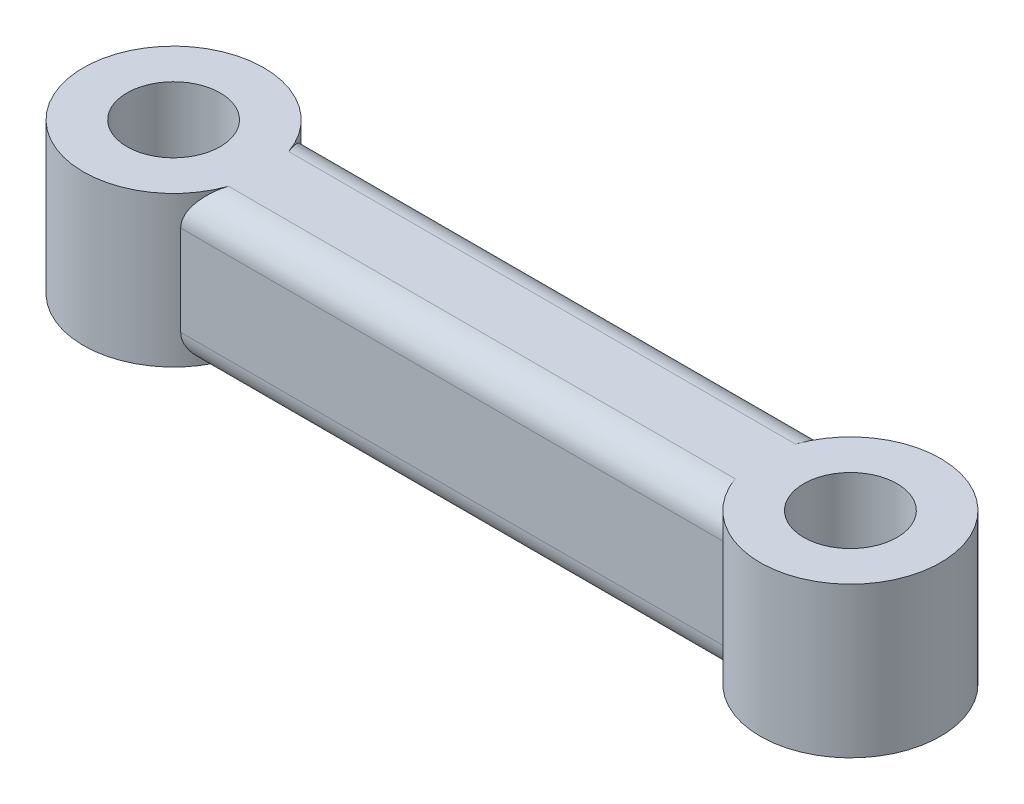
ISO-10303-21;
HEADER;
FILE_DESCRIPTION(('STEP AP214'),'2;1');
FILE_NAME('part.step','',(''),(''),'','','');
FILE_SCHEMA(('AUTOMOTIVE_DESIGN { 1 0 10303 214 1 1 1 1 }'));
ENDSEC;
DATA;
#1=APPLICATION_CONTEXT('core data for automotive mechanical design processes');
#2=APPLICATION_PROTOCOL_DEFINITION('international standard','automotive_design',2000,#1);
#3=PRODUCT_CONTEXT('',#1,'mechanical');
#4=PRODUCT('Part','Part','',(#3));
#5=PRODUCT_RELATED_PRODUCT_CATEGORY('part','',(#4));
#6=PRODUCT_DEFINITION_FORMATION('','',#4);
#7=PRODUCT_DEFINITION_CONTEXT('part definition',#1,'design');
#8=PRODUCT_DEFINITION('design','',#6,#7);
#9=PRODUCT_DEFINITION_SHAPE('','',#8);
#10=(LENGTH_UNIT() NAMED_UNIT(*) SI_UNIT(.MILLI.,.METRE.));
#11=(NAMED_UNIT(*) PLANE_ANGLE_UNIT() SI_UNIT($,.RADIAN.));
#12=(NAMED_UNIT(*) SI_UNIT($,.STERADIAN.) SOLID_ANGLE_UNIT());
#13=UNCERTAINTY_MEASURE_WITH_UNIT(LENGTH_MEASURE(1.E-05),#10,'distance_accuracy_value','');
#14=(GEOMETRIC_REPRESENTATION_CONTEXT(3) GLOBAL_UNCERTAINTY_ASSIGNED_CONTEXT((#13)) GLOBAL_UNIT_ASSIGNED_CONTEXT((#10,
#11,#12)) REPRESENTATION_CONTEXT('',''));
#15=CARTESIAN_POINT('',(0.,0.,0.));
#16=DIRECTION('',(0.,0.,1.));
#17=DIRECTION('',(1.,0.,0.));
#18=AXIS2_PLACEMENT_3D('',#15,#16,#17);
#19=CARTESIAN_POINT('',(-11.25,5.,0.));
#20=DIRECTION('',(0.,1.,0.));
#21=DIRECTION('',(0.,0.,1.));
#22=AXIS2_PLACEMENT_3D('',#19,#20,#21);
#23=PLANE('',#22);
#24=CARTESIAN_POINT('',(-11.25,5.,0.));
#25=DIRECTION('',(0.,1.,0.));
#26=DIRECTION('',(0.,0.,1.));
#27=AXIS2_PLACEMENT_3D('',#24,#25,#26);
#28=CIRCLE('',#27,1.55000000000002);
#29=CARTESIAN_POINT('',(-11.25,5.,1.55));
#30=VERTEX_POINT('',#29);
#31=EDGE_CURVE('E274',#30,#30,#28,.T.);
#32=ORIENTED_EDGE('',*,*,#31,.F.);
#33=EDGE_LOOP('',(#32));
#34=FACE_BOUND('',#33,.T.);
#35=DIRECTION('',(-1.,0.,0.));
#36=VECTOR('',#35,1.);
#37=CARTESIAN_POINT('',(-9.01393202250021,5.,-1.00000000000001));
#38=LINE('',#37,#36);
#39=CARTESIAN_POINT('',(8.42157287525381,5.,-1.00000000000001));
#40=VERTEX_POINT('',#39);
#41=CARTESIAN_POINT('',(-8.42157287525381,5.,-1.00000000000001));
#42=VERTEX_POINT('',#41);
#43=EDGE_CURVE('E169',#40,#42,#38,.T.);
#44=ORIENTED_EDGE('',*,*,#43,.T.);
#45=CARTESIAN_POINT('',(-11.25,5.,0.));
#46=DIRECTION('',(0.,1.,0.));
#47=DIRECTION('',(0.,0.,1.));
#48=AXIS2_PLACEMENT_3D('',#45,#46,#47);
#49=CIRCLE('',#48,3.);
#50=CARTESIAN_POINT('',(-8.42157287525381,5.,0.999999999999986));
#51=VERTEX_POINT('',#50);
#52=EDGE_CURVE('E66',#42,#51,#49,.T.);
#53=ORIENTED_EDGE('',*,*,#52,.T.);
#54=DIRECTION('',(1.,0.,0.));
#55=VECTOR('',#54,1.);
#56=CARTESIAN_POINT('',(9.01393202250021,5.,0.999999999999986));
#57=LINE('',#56,#55);
#58=CARTESIAN_POINT('',(8.42157287525381,5.,0.999999999999986));
#59=VERTEX_POINT('',#58);
#60=EDGE_CURVE('E166',#51,#59,#57,.T.);
#61=ORIENTED_EDGE('',*,*,#60,.T.);
#62=CARTESIAN_POINT('',(11.25,5.,0.));
#63=DIRECTION('',(0.,1.,0.));
#64=DIRECTION('',(0.,0.,1.));
#65=AXIS2_PLACEMENT_3D('',#62,#63,#64);
#66=CIRCLE('',#65,3.);
#67=EDGE_CURVE('E74',#59,#40,#66,.T.);
#68=ORIENTED_EDGE('',*,*,#67,.T.);
#69=EDGE_LOOP('',(#44,#53,#61,#68));
#70=FACE_BOUND('',#69,.T.);
#71=CARTESIAN_POINT('',(11.25,5.,0.));
#72=DIRECTION('',(0.,1.,0.));
#73=DIRECTION('',(0.,0.,1.));
#74=AXIS2_PLACEMENT_3D('',#71,#72,#73);
#75=CIRCLE('',#74,1.55000000000002);
#76=CARTESIAN_POINT('',(11.25,5.,1.55));
#77=VERTEX_POINT('',#76);
#78=EDGE_CURVE('E263',#77,#77,#75,.T.);
#79=ORIENTED_EDGE('',*,*,#78,.F.);
#80=EDGE_LOOP('',(#79));
#81=FACE_BOUND('',#80,.T.);
#82=ADVANCED_FACE('F45',(#34,#70,#81),#23,.T.);
#83=CARTESIAN_POINT('',(-11.25,0.,0.));
#84=DIRECTION('',(0.,1.,0.));
#85=DIRECTION('',(0.,0.,1.));
#86=AXIS2_PLACEMENT_3D('',#83,#84,#85);
#87=PLANE('',#86);
#88=CARTESIAN_POINT('',(-11.25,0.,0.));
#89=DIRECTION('',(0.,1.,0.));
#90=DIRECTION('',(0.,0.,1.));
#91=AXIS2_PLACEMENT_3D('',#88,#89,#90);
#92=CIRCLE('',#91,3.);
#93=CARTESIAN_POINT('',(-8.42157287525381,0.,-1.00000000000001));
#94=VERTEX_POINT('',#93);
#95=CARTESIAN_POINT('',(-8.42157287525381,0.,0.999999999999986));
#96=VERTEX_POINT('',#95);
#97=EDGE_CURVE('E278',#94,#96,#92,.T.);
#98=ORIENTED_EDGE('',*,*,#97,.F.);
#99=DIRECTION('',(-1.,0.,0.));
#100=VECTOR('',#99,1.);
#101=CARTESIAN_POINT('',(-11.25,0.,-1.00000000000001));
#102=LINE('',#101,#100);
#103=CARTESIAN_POINT('',(8.42157287525381,0.,-1.00000000000001));
#104=VERTEX_POINT('',#103);
#105=EDGE_CURVE('E155',#94,#104,#102,.F.);
#106=ORIENTED_EDGE('',*,*,#105,.T.);
#107=CARTESIAN_POINT('',(11.25,0.,0.));
#108=DIRECTION('',(0.,1.,0.));
#109=DIRECTION('',(0.,0.,1.));
#110=AXIS2_PLACEMENT_3D('',#107,#108,#109);
#111=CIRCLE('',#110,3.);
#112=CARTESIAN_POINT('',(8.42157287525381,0.,0.999999999999986));
#113=VERTEX_POINT('',#112);
#114=EDGE_CURVE('E284',#113,#104,#111,.T.);
#115=ORIENTED_EDGE('',*,*,#114,.F.);
#116=DIRECTION('',(1.,0.,0.));
#117=VECTOR('',#116,1.);
#118=CARTESIAN_POINT('',(-11.25,0.,0.999999999999986));
#119=LINE('',#118,#117);
#120=EDGE_CURVE('E145',#113,#96,#119,.F.);
#121=ORIENTED_EDGE('',*,*,#120,.T.);
#122=EDGE_LOOP('',(#98,#106,#115,#121));
#123=FACE_BOUND('',#122,.T.);
#124=CARTESIAN_POINT('',(-11.25,0.,0.));
#125=DIRECTION('',(0.,1.,0.));
#126=DIRECTION('',(0.,0.,1.));
#127=AXIS2_PLACEMENT_3D('',#124,#125,#126);
#128=CIRCLE('',#127,1.55000000000002);
#129=CARTESIAN_POINT('',(-11.25,0.,1.55));
#130=VERTEX_POINT('',#129);
#131=EDGE_CURVE('E271',#130,#130,#128,.T.);
#132=ORIENTED_EDGE('',*,*,#131,.T.);
#133=EDGE_LOOP('',(#132));
#134=FACE_BOUND('',#133,.T.);
#135=CARTESIAN_POINT('',(11.25,0.,0.));
#136=DIRECTION('',(0.,1.,0.));
#137=DIRECTION('',(0.,0.,1.));
#138=AXIS2_PLACEMENT_3D('',#135,#136,#137);
#139=CIRCLE('',#138,1.55000000000002);
#140=CARTESIAN_POINT('',(11.25,0.,1.55));
#141=VERTEX_POINT('',#140);
#142=EDGE_CURVE('E266',#141,#141,#139,.T.);
#143=ORIENTED_EDGE('',*,*,#142,.T.);
#144=EDGE_LOOP('',(#143));
#145=FACE_BOUND('',#144,.T.);
#146=ADVANCED_FACE('F242',(#123,#134,#145),#87,.F.);
#147=CARTESIAN_POINT('',(-11.25,5.,0.));
#148=DIRECTION('',(0.,-1.,0.));
#149=DIRECTION('',(0.,0.,-1.));
#150=AXIS2_PLACEMENT_3D('',#147,#148,#149);
#151=CYLINDRICAL_SURFACE('',#150,3.);
#152=ORIENTED_EDGE('',*,*,#97,.T.);
#153=CARTESIAN_POINT('',(-8.42157287525381,0.,0.999999999999986));
#154=CARTESIAN_POINT('',(-8.43233517576139,1.47025831379735E-07,1.03044942642672));
#155=CARTESIAN_POINT('',(-8.44358757525056,0.00139098588075769,1.06070098630823));
#156=CARTESIAN_POINT('',(-8.46696373571454,0.00684325564355595,1.12059756215042));
#157=CARTESIAN_POINT('',(-8.47908686796006,0.0109027765076651,1.150242996295));
#158=CARTESIAN_POINT('',(-8.51648530016051,0.026862503564235,1.23769606182971));
#159=CARTESIAN_POINT('',(-8.54291075093985,0.0425464544835447,1.29436082483727));
#160=CARTESIAN_POINT('',(-8.59763306949416,0.0830028766976726,1.40308786306568));
#161=CARTESIAN_POINT('',(-8.62592484043369,0.107751372161834,1.4551618342397));
#162=CARTESIAN_POINT('',(-8.6833068382165,0.165604235260205,1.55414443882939));
#163=CARTESIAN_POINT('',(-8.71239874224372,0.198727572140649,1.60104099408684));
#164=CARTESIAN_POINT('',(-8.77242040473922,0.27596784456181,1.69258643314291));
#165=CARTESIAN_POINT('',(-8.80328884317301,0.320792154059737,1.73668153203027));
#166=CARTESIAN_POINT('',(-8.86191393352655,0.419134072679211,1.81644889482888));
#167=CARTESIAN_POINT('',(-8.88967563840865,0.4726372083203,1.8521349433923));
#168=CARTESIAN_POINT('',(-8.93157850747652,0.570312165104469,1.90412268271449));
#169=CARTESIAN_POINT('',(-8.9473014831952,0.612425169892272,1.92302400556256));
#170=CARTESIAN_POINT('',(-8.9744498789463,0.700006481076328,1.9550733900818));
#171=CARTESIAN_POINT('',(-8.98588897473448,0.745463546196448,1.96823978214784));
#172=CARTESIAN_POINT('',(-9.00086196439744,0.825815176698794,1.98531460279487));
#173=CARTESIAN_POINT('',(-9.00570884035617,0.86013874998483,1.99077843535268));
#174=CARTESIAN_POINT('',(-9.01226906461626,0.929623614997975,1.99814093878302));
#175=CARTESIAN_POINT('',(-9.0139672685714,0.964788135638415,2.00002238038764));
#176=CARTESIAN_POINT('',(-9.01393202250021,1.,1.99999999999999));
#177=B_SPLINE_CURVE_WITH_KNOTS('',3,(#153,#154,#155,#156,#157,#158,#159,#160,#161,#162,#163,
#164,#165,#166,#167,#168,#169,#170,#171,#172,#173,#174,#175,#176),.UNSPECIFIED.,.F.,.F.,(4,2,2,
2,2,2,2,2,2,2,2,4),(0.,0.0968109008177377,0.193552586933967,0.385966911207454,0.577875929835666,
0.770223583868757,0.979365970066733,1.18816309386807,1.33392917155905,1.47922585995186,
1.58418679582683,1.68965127161098),.UNSPECIFIED.);
#178=CARTESIAN_POINT('',(-9.01393202250021,1.,1.99999999999999));
#179=VERTEX_POINT('',#178);
#180=EDGE_CURVE('E125',#96,#179,#177,.T.);
#181=ORIENTED_EDGE('',*,*,#180,.T.);
#182=DIRECTION('',(0.,-1.,0.));
#183=VECTOR('',#182,1.);
#184=CARTESIAN_POINT('',(-9.01393202250021,5.,1.99999999999999));
#185=LINE('',#184,#183);
#186=CARTESIAN_POINT('',(-9.01393202250021,4.,1.99999999999999));
#187=VERTEX_POINT('',#186);
#188=EDGE_CURVE('E141',#187,#179,#185,.T.);
#189=ORIENTED_EDGE('',*,*,#188,.F.);
#190=CARTESIAN_POINT('',(-9.01393202250021,4.,1.99999999999999));
#191=CARTESIAN_POINT('',(-9.01393796557844,4.02391674017118,2.00000329668173));
#192=CARTESIAN_POINT('',(-9.01316380923422,4.04781798398738,1.99914135987713));
#193=CARTESIAN_POINT('',(-9.0101144678481,4.0953794948633,1.99572567445577));
#194=CARTESIAN_POINT('',(-9.00784078329477,4.11903997882953,1.99317361703143));
#195=CARTESIAN_POINT('',(-8.99891819019792,4.18893541764985,1.98310696948458));
#196=CARTESIAN_POINT('',(-8.9901651638575,4.2345831983466,1.97318007186762));
#197=CARTESIAN_POINT('',(-8.96807102819015,4.32279452639175,1.94758280817724));
#198=CARTESIAN_POINT('',(-8.95474667953703,4.36536866244477,1.93193340994153));
#199=CARTESIAN_POINT('',(-8.92464682588156,4.44711486052573,1.89559786093323));
#200=CARTESIAN_POINT('',(-8.9078614164918,4.48627668973856,1.87489722332746));
#201=CARTESIAN_POINT('',(-8.86497890475231,4.57522117108196,1.82024603742725));
#202=CARTESIAN_POINT('',(-8.83779434408434,4.62323692554223,1.78426977251349));
#203=CARTESIAN_POINT('',(-8.78125407679592,4.71149795447996,1.70518744868163));
#204=CARTESIAN_POINT('',(-8.75189568589789,4.75173339272668,1.66207249081698));
#205=CARTESIAN_POINT('',(-8.69248402572522,4.8243781906931,1.56913530651191));
#206=CARTESIAN_POINT('',(-8.66242666204114,4.85669601861478,1.51924413626164));
#207=CARTESIAN_POINT('',(-8.60349752930198,4.91217000304991,1.414090218862));
#208=CARTESIAN_POINT('',(-8.57462358028198,4.9353437527091,1.35883804409186));
#209=CARTESIAN_POINT('',(-8.52399277789994,4.9685848152875,1.25366576913304));
#210=CARTESIAN_POINT('',(-8.50185706767676,4.980203774164,1.20441887915713));
#211=CARTESIAN_POINT('',(-8.45984244217292,4.99592564241239,1.10365997855418));
#212=CARTESIAN_POINT('',(-8.43996985249315,5.00000794772756,1.05214215153635));
#213=CARTESIAN_POINT('',(-8.42157287525381,5.,0.999999999999986));
#214=B_SPLINE_CURVE_WITH_KNOTS('',3,(#190,#191,#192,#193,#194,#195,#196,#197,#198,#199,#200,
#201,#202,#203,#204,#205,#206,#207,#208,#209,#210,#211,#212,#213),.UNSPECIFIED.,.F.,.F.,(4,2,2,
2,2,2,2,2,2,2,2,4),(0.,0.0716933308614944,0.143315031101967,0.285085731109906,0.426342090125624,
0.568008431369151,0.764585362662296,0.961409213546178,1.16041114714833,1.35902831333613,
1.52413471356289,1.6896918247817),.UNSPECIFIED.);
#215=EDGE_CURVE('E11',#187,#51,#214,.T.);
#216=ORIENTED_EDGE('',*,*,#215,.T.);
#217=ORIENTED_EDGE('',*,*,#52,.F.);
#218=CARTESIAN_POINT('',(-8.42157287525381,5.,-1.00000000000001));
#219=CARTESIAN_POINT('',(-8.43233517576139,4.99999985297417,-1.03044942642674));
#220=CARTESIAN_POINT('',(-8.44358757525056,4.99860901411924,-1.06070098630826));
#221=CARTESIAN_POINT('',(-8.46696373571454,4.99315674435644,-1.12059756215044));
#222=CARTESIAN_POINT('',(-8.47908686796006,4.98909722349233,-1.15024299629503));
#223=CARTESIAN_POINT('',(-8.51648530016051,4.97313749643577,-1.23769606182974));
#224=CARTESIAN_POINT('',(-8.54291075093985,4.95745354551646,-1.2943608248373));
#225=CARTESIAN_POINT('',(-8.59763306949416,4.91699712330233,-1.40308786306571));
#226=CARTESIAN_POINT('',(-8.62592484043369,4.89224862783817,-1.45516183423972));
#227=CARTESIAN_POINT('',(-8.6833068382165,4.83439576473979,-1.55414443882942));
#228=CARTESIAN_POINT('',(-8.71239874224371,4.80127242785935,-1.60104099408686));
#229=CARTESIAN_POINT('',(-8.77242040473922,4.72403215543819,-1.69258643314294));
#230=CARTESIAN_POINT('',(-8.80328884317301,4.67920784594026,-1.7366815320303));
#231=CARTESIAN_POINT('',(-8.86191393352655,4.58086592732079,-1.81644889482891));
#232=CARTESIAN_POINT('',(-8.88967563840865,4.5273627916797,-1.85213494339233));
#233=CARTESIAN_POINT('',(-8.93157850747652,4.42968783489553,-1.90412268271452));
#234=CARTESIAN_POINT('',(-8.9473014831952,4.38757483010773,-1.92302400556259));
#235=CARTESIAN_POINT('',(-8.9744498789463,4.29999351892367,-1.95507339008183));
#236=CARTESIAN_POINT('',(-8.98588897473448,4.25453645380355,-1.96823978214787));
#237=CARTESIAN_POINT('',(-9.00086196439744,4.1741848233012,-1.9853146027949));
#238=CARTESIAN_POINT('',(-9.00570884035617,4.13986125001517,-1.99077843535271));
#239=CARTESIAN_POINT('',(-9.01226906461626,4.07037638500202,-1.99814093878305));
#240=CARTESIAN_POINT('',(-9.0139672685714,4.03521186436158,-2.00002238038767));
#241=CARTESIAN_POINT('',(-9.01393202250021,4.,-2.00000000000001));
#242=B_SPLINE_CURVE_WITH_KNOTS('',3,(#218,#219,#220,#221,#222,#223,#224,#225,#226,#227,#228,
#229,#230,#231,#232,#233,#234,#235,#236,#237,#238,#239,#240,#241),.UNSPECIFIED.,.F.,.F.,(4,2,2,
2,2,2,2,2,2,2,2,4),(0.,0.0968109008177375,0.193552586933967,0.385966911207455,0.577875929835666,
0.770223583868757,0.979365970066734,1.18816309386807,1.33392917155905,1.47922585995186,
1.58418679582683,1.68965127161098),.UNSPECIFIED.);
#243=CARTESIAN_POINT('',(-9.01393202250021,4.,-2.00000000000001));
#244=VERTEX_POINT('',#243);
#245=EDGE_CURVE('E115',#42,#244,#242,.T.);
#246=ORIENTED_EDGE('',*,*,#245,.T.);
#247=DIRECTION('',(0.,-1.,0.));
#248=VECTOR('',#247,1.);
#249=CARTESIAN_POINT('',(-9.01393202250021,5.,-2.00000000000001));
#250=LINE('',#249,#248);
#251=CARTESIAN_POINT('',(-9.01393202250021,1.,-2.00000000000001));
#252=VERTEX_POINT('',#251);
#253=EDGE_CURVE('E119',#244,#252,#250,.T.);
#254=ORIENTED_EDGE('',*,*,#253,.T.);
#255=CARTESIAN_POINT('',(-9.01393202250021,1.,-2.00000000000001));
#256=CARTESIAN_POINT('',(-9.01393796557844,0.976083259828825,-2.00000329668176));
#257=CARTESIAN_POINT('',(-9.01316380923422,0.952182016012617,-1.99914135987716));
#258=CARTESIAN_POINT('',(-9.0101144678481,0.904620505136705,-1.99572567445579));
#259=CARTESIAN_POINT('',(-9.00784078329477,0.880960021170475,-1.99317361703145));
#260=CARTESIAN_POINT('',(-8.99891819019792,0.811064582350152,-1.9831069694846));
#261=CARTESIAN_POINT('',(-8.9901651638575,0.765416801653398,-1.97318007186765));
#262=CARTESIAN_POINT('',(-8.96807102819015,0.677205473608251,-1.94758280817726));
#263=CARTESIAN_POINT('',(-8.95474667953703,0.634631337555232,-1.93193340994156));
#264=CARTESIAN_POINT('',(-8.92464682588156,0.552885139474272,-1.89559786093326));
#265=CARTESIAN_POINT('',(-8.9078614164918,0.513723310261438,-1.87489722332748));
#266=CARTESIAN_POINT('',(-8.86497890475231,0.424778828918037,-1.82024603742727));
#267=CARTESIAN_POINT('',(-8.83779434408434,0.376763074457771,-1.78426977251352));
#268=CARTESIAN_POINT('',(-8.78125407679592,0.28850204552004,-1.70518744868166));
#269=CARTESIAN_POINT('',(-8.75189568589789,0.24826660727332,-1.66207249081701));
#270=CARTESIAN_POINT('',(-8.69248402572522,0.1756218093069,-1.56913530651194));
#271=CARTESIAN_POINT('',(-8.66242666204115,0.143303981385224,-1.51924413626167));
#272=CARTESIAN_POINT('',(-8.60349752930199,0.08782999695009,-1.41409021886203));
#273=CARTESIAN_POINT('',(-8.57462358028198,0.0646562472909031,-1.35883804409189));
#274=CARTESIAN_POINT('',(-8.52399277789994,0.0314151847125046,-1.25366576913306));
#275=CARTESIAN_POINT('',(-8.50185706767676,0.0197962258360041,-1.20441887915716));
#276=CARTESIAN_POINT('',(-8.45984244217292,0.00407435758760779,-1.10365997855421));
#277=CARTESIAN_POINT('',(-8.43996985249315,-7.94772755718988E-06,-1.05214215153638));
#278=CARTESIAN_POINT('',(-8.42157287525381,0.,-1.00000000000001));
#279=B_SPLINE_CURVE_WITH_KNOTS('',3,(#255,#256,#257,#258,#259,#260,#261,#262,#263,#264,#265,
#266,#267,#268,#269,#270,#271,#272,#273,#274,#275,#276,#277,#278),.UNSPECIFIED.,.F.,.F.,(4,2,2,
2,2,2,2,2,2,2,2,4),(0.,0.0716933308614927,0.143315031101966,0.285085731109906,0.426342090125624,
0.568008431369151,0.764585362662296,0.961409213546179,1.16041114714833,1.35902831333613,
1.52413471356289,1.6896918247817),.UNSPECIFIED.);
#280=EDGE_CURVE('E172',#252,#94,#279,.T.);
#281=ORIENTED_EDGE('',*,*,#280,.T.);
#282=EDGE_LOOP('',(#152,#181,#189,#216,#217,#246,#254,#281));
#283=FACE_BOUND('',#282,.T.);
#284=ADVANCED_FACE('F117',(#283),#151,.T.);
#285=CARTESIAN_POINT('',(-9.01393202250021,5.,1.99999999999999));
#286=DIRECTION('',(0.,0.,-1.));
#287=DIRECTION('',(-1.,0.,0.));
#288=AXIS2_PLACEMENT_3D('',#285,#286,#287);
#289=PLANE('',#288);
#290=ORIENTED_EDGE('',*,*,#188,.T.);
#291=DIRECTION('',(1.,0.,0.));
#292=VECTOR('',#291,1.);
#293=CARTESIAN_POINT('',(-9.01393202250021,1.,1.99999999999999));
#294=LINE('',#293,#292);
#295=CARTESIAN_POINT('',(9.01393202250021,1.,1.99999999999999));
#296=VERTEX_POINT('',#295);
#297=EDGE_CURVE('E162',#179,#296,#294,.T.);
#298=ORIENTED_EDGE('',*,*,#297,.T.);
#299=DIRECTION('',(0.,-1.,0.));
#300=VECTOR('',#299,1.);
#301=CARTESIAN_POINT('',(9.01393202250021,5.,1.99999999999999));
#302=LINE('',#301,#300);
#303=CARTESIAN_POINT('',(9.01393202250021,4.,1.99999999999999));
#304=VERTEX_POINT('',#303);
#305=EDGE_CURVE('E148',#304,#296,#302,.T.);
#306=ORIENTED_EDGE('',*,*,#305,.F.);
#307=DIRECTION('',(1.,0.,0.));
#308=VECTOR('',#307,1.);
#309=CARTESIAN_POINT('',(-9.01393202250021,4.,1.99999999999999));
#310=LINE('',#309,#308);
#311=EDGE_CURVE('E159',#304,#187,#310,.F.);
#312=ORIENTED_EDGE('',*,*,#311,.T.);
#313=EDGE_LOOP('',(#290,#298,#306,#312));
#314=FACE_BOUND('',#313,.T.);
#315=ADVANCED_FACE('F231',(#314),#289,.F.);
#316=CARTESIAN_POINT('',(11.25,5.,0.));
#317=DIRECTION('',(0.,-1.,0.));
#318=DIRECTION('',(0.,0.,-1.));
#319=AXIS2_PLACEMENT_3D('',#316,#317,#318);
#320=CYLINDRICAL_SURFACE('',#319,3.);
#321=ORIENTED_EDGE('',*,*,#114,.T.);
#322=CARTESIAN_POINT('',(8.42157287525381,0.,-1.00000000000001));
#323=CARTESIAN_POINT('',(8.43233517576139,1.47025831362716E-07,-1.03044942642674));
#324=CARTESIAN_POINT('',(8.44358757525056,0.00139098588075766,-1.06070098630826));
#325=CARTESIAN_POINT('',(8.46696373571454,0.00684325564355592,-1.12059756215044));
#326=CARTESIAN_POINT('',(8.47908686796006,0.0109027765076651,-1.15024299629503));
#327=CARTESIAN_POINT('',(8.51648530016051,0.0268625035642352,-1.23769606182974));
#328=CARTESIAN_POINT('',(8.54291075093985,0.042546454483545,-1.2943608248373));
#329=CARTESIAN_POINT('',(8.59763306949416,0.0830028766976728,-1.40308786306571));
#330=CARTESIAN_POINT('',(8.62592484043369,0.107751372161834,-1.45516183423972));
#331=CARTESIAN_POINT('',(8.6833068382165,0.165604235260205,-1.55414443882942));
#332=CARTESIAN_POINT('',(8.71239874224371,0.19872757214065,-1.60104099408686));
#333=CARTESIAN_POINT('',(8.77242040473922,0.27596784456181,-1.69258643314294));
#334=CARTESIAN_POINT('',(8.80328884317301,0.320792154059737,-1.7366815320303));
#335=CARTESIAN_POINT('',(8.86191393352655,0.419134072679212,-1.81644889482891));
#336=CARTESIAN_POINT('',(8.88967563840865,0.472637208320301,-1.85213494339233));
#337=CARTESIAN_POINT('',(8.93157850747652,0.57031216510447,-1.90412268271452));
#338=CARTESIAN_POINT('',(8.9473014831952,0.612425169892274,-1.92302400556259));
#339=CARTESIAN_POINT('',(8.9744498789463,0.70000648107633,-1.95507339008183));
#340=CARTESIAN_POINT('',(8.98588897473448,0.745463546196451,-1.96823978214787));
#341=CARTESIAN_POINT('',(9.00086196439744,0.825815176698796,-1.9853146027949));
#342=CARTESIAN_POINT('',(9.00570884035617,0.860138749984832,-1.99077843535271));
#343=CARTESIAN_POINT('',(9.01226906461626,0.929623614997975,-1.99814093878305));
#344=CARTESIAN_POINT('',(9.0139672685714,0.964788135638416,-2.00002238038767));
#345=CARTESIAN_POINT('',(9.01393202250021,1.,-2.00000000000001));
#346=B_SPLINE_CURVE_WITH_KNOTS('',3,(#322,#323,#324,#325,#326,#327,#328,#329,#330,#331,#332,
#333,#334,#335,#336,#337,#338,#339,#340,#341,#342,#343,#344,#345),.UNSPECIFIED.,.F.,.F.,(4,2,2,
2,2,2,2,2,2,2,2,4),(0.,0.0968109008177373,0.193552586933967,0.385966911207455,0.577875929835666,
0.770223583868757,0.979365970066734,1.18816309386807,1.33392917155905,1.47922585995186,
1.58418679582683,1.68965127161098),.UNSPECIFIED.);
#347=CARTESIAN_POINT('',(9.01393202250021,1.,-2.00000000000001));
#348=VERTEX_POINT('',#347);
#349=EDGE_CURVE('E180',#104,#348,#346,.T.);
#350=ORIENTED_EDGE('',*,*,#349,.T.);
#351=DIRECTION('',(0.,-1.,0.));
#352=VECTOR('',#351,1.);
#353=CARTESIAN_POINT('',(9.01393202250021,5.,-2.00000000000001));
#354=LINE('',#353,#352);
#355=CARTESIAN_POINT('',(9.01393202250021,4.,-2.00000000000001));
#356=VERTEX_POINT('',#355);
#357=EDGE_CURVE('E136',#356,#348,#354,.T.);
#358=ORIENTED_EDGE('',*,*,#357,.F.);
#359=CARTESIAN_POINT('',(9.01393202250021,4.,-2.00000000000001));
#360=CARTESIAN_POINT('',(9.01393796557844,4.02391674017117,-2.00000329668176));
#361=CARTESIAN_POINT('',(9.01316380923422,4.04781798398738,-1.99914135987716));
#362=CARTESIAN_POINT('',(9.0101144678481,4.09537949486329,-1.99572567445579));
#363=CARTESIAN_POINT('',(9.00784078329477,4.11903997882952,-1.99317361703145));
#364=CARTESIAN_POINT('',(8.99891819019792,4.18893541764985,-1.9831069694846));
#365=CARTESIAN_POINT('',(8.9901651638575,4.2345831983466,-1.97318007186765));
#366=CARTESIAN_POINT('',(8.96807102819015,4.32279452639175,-1.94758280817726));
#367=CARTESIAN_POINT('',(8.95474667953703,4.36536866244477,-1.93193340994156));
#368=CARTESIAN_POINT('',(8.92464682588156,4.44711486052573,-1.89559786093326));
#369=CARTESIAN_POINT('',(8.9078614164918,4.48627668973856,-1.87489722332748));
#370=CARTESIAN_POINT('',(8.86497890475231,4.57522117108196,-1.82024603742728));
#371=CARTESIAN_POINT('',(8.83779434408434,4.62323692554223,-1.78426977251352));
#372=CARTESIAN_POINT('',(8.78125407679592,4.71149795447996,-1.70518744868166));
#373=CARTESIAN_POINT('',(8.75189568589789,4.75173339272668,-1.66207249081701));
#374=CARTESIAN_POINT('',(8.69248402572522,4.8243781906931,-1.56913530651194));
#375=CARTESIAN_POINT('',(8.66242666204115,4.85669601861478,-1.51924413626167));
#376=CARTESIAN_POINT('',(8.60349752930199,4.91217000304991,-1.41409021886203));
#377=CARTESIAN_POINT('',(8.57462358028198,4.9353437527091,-1.35883804409189));
#378=CARTESIAN_POINT('',(8.52399277789994,4.9685848152875,-1.25366576913307));
#379=CARTESIAN_POINT('',(8.50185706767676,4.980203774164,-1.20441887915716));
#380=CARTESIAN_POINT('',(8.45984244217292,4.99592564241239,-1.10365997855421));
#381=CARTESIAN_POINT('',(8.43996985249315,5.00000794772756,-1.05214215153638));
#382=CARTESIAN_POINT('',(8.42157287525381,5.,-1.00000000000001));
#383=B_SPLINE_CURVE_WITH_KNOTS('',3,(#359,#360,#361,#362,#363,#364,#365,#366,#367,#368,#369,
#370,#371,#372,#373,#374,#375,#376,#377,#378,#379,#380,#381,#382),.UNSPECIFIED.,.F.,.F.,(4,2,2,
2,2,2,2,2,2,2,2,4),(0.,0.0716933308614927,0.143315031101966,0.285085731109905,0.426342090125623,
0.568008431369151,0.764585362662296,0.961409213546178,1.16041114714833,1.35902831333613,
1.52413471356289,1.6896918247817),.UNSPECIFIED.);
#384=EDGE_CURVE('E124',#356,#40,#383,.T.);
#385=ORIENTED_EDGE('',*,*,#384,.T.);
#386=ORIENTED_EDGE('',*,*,#67,.F.);
#387=CARTESIAN_POINT('',(8.42157287525381,5.,0.999999999999986));
#388=CARTESIAN_POINT('',(8.43233517576139,4.99999985297417,1.03044942642672));
#389=CARTESIAN_POINT('',(8.44358757525056,4.99860901411924,1.06070098630823));
#390=CARTESIAN_POINT('',(8.46696373571454,4.99315674435644,1.12059756215041));
#391=CARTESIAN_POINT('',(8.47908686796006,4.98909722349233,1.150242996295));
#392=CARTESIAN_POINT('',(8.51648530016051,4.97313749643577,1.23769606182971));
#393=CARTESIAN_POINT('',(8.54291075093985,4.95745354551646,1.29436082483727));
#394=CARTESIAN_POINT('',(8.59763306949416,4.91699712330233,1.40308786306568));
#395=CARTESIAN_POINT('',(8.62592484043369,4.89224862783817,1.4551618342397));
#396=CARTESIAN_POINT('',(8.6833068382165,4.83439576473979,1.55414443882939));
#397=CARTESIAN_POINT('',(8.71239874224372,4.80127242785935,1.60104099408683));
#398=CARTESIAN_POINT('',(8.77242040473922,4.72403215543819,1.69258643314291));
#399=CARTESIAN_POINT('',(8.80328884317301,4.67920784594026,1.73668153203027));
#400=CARTESIAN_POINT('',(8.86191393352655,4.58086592732079,1.81644889482888));
#401=CARTESIAN_POINT('',(8.88967563840865,4.5273627916797,1.8521349433923));
#402=CARTESIAN_POINT('',(8.93157850747652,4.42968783489553,1.90412268271449));
#403=CARTESIAN_POINT('',(8.9473014831952,4.38757483010773,1.92302400556256));
#404=CARTESIAN_POINT('',(8.9744498789463,4.29999351892367,1.9550733900818));
#405=CARTESIAN_POINT('',(8.98588897473448,4.25453645380355,1.96823978214784));
#406=CARTESIAN_POINT('',(9.00086196439744,4.17418482330121,1.98531460279487));
#407=CARTESIAN_POINT('',(9.00570884035617,4.13986125001517,1.99077843535268));
#408=CARTESIAN_POINT('',(9.01226906461626,4.07037638500202,1.99814093878302));
#409=CARTESIAN_POINT('',(9.0139672685714,4.03521186436158,2.00002238038764));
#410=CARTESIAN_POINT('',(9.01393202250021,4.,1.99999999999999));
#411=B_SPLINE_CURVE_WITH_KNOTS('',3,(#387,#388,#389,#390,#391,#392,#393,#394,#395,#396,#397,
#398,#399,#400,#401,#402,#403,#404,#405,#406,#407,#408,#409,#410),.UNSPECIFIED.,.F.,.F.,(4,2,2,
2,2,2,2,2,2,2,2,4),(0.,0.0968109008177375,0.193552586933967,0.385966911207454,0.577875929835666,
0.770223583868757,0.979365970066733,1.18816309386807,1.33392917155905,1.47922585995186,
1.58418679582683,1.68965127161098),.UNSPECIFIED.);
#412=EDGE_CURVE('E60',#59,#304,#411,.T.);
#413=ORIENTED_EDGE('',*,*,#412,.T.);
#414=ORIENTED_EDGE('',*,*,#305,.T.);
#415=CARTESIAN_POINT('',(9.01393202250021,1.,1.99999999999999));
#416=CARTESIAN_POINT('',(9.01393796557844,0.976083259828825,2.00000329668173));
#417=CARTESIAN_POINT('',(9.01316380923422,0.952182016012617,1.99914135987713));
#418=CARTESIAN_POINT('',(9.0101144678481,0.904620505136705,1.99572567445577));
#419=CARTESIAN_POINT('',(9.00784078329477,0.880960021170475,1.99317361703143));
#420=CARTESIAN_POINT('',(8.99891819019792,0.811064582350152,1.98310696948458));
#421=CARTESIAN_POINT('',(8.9901651638575,0.765416801653398,1.97318007186762));
#422=CARTESIAN_POINT('',(8.96807102819015,0.677205473608251,1.94758280817724));
#423=CARTESIAN_POINT('',(8.95474667953703,0.634631337555231,1.93193340994153));
#424=CARTESIAN_POINT('',(8.92464682588156,0.552885139474272,1.89559786093323));
#425=CARTESIAN_POINT('',(8.9078614164918,0.513723310261438,1.87489722332746));
#426=CARTESIAN_POINT('',(8.86497890475231,0.424778828918038,1.82024603742725));
#427=CARTESIAN_POINT('',(8.83779434408434,0.376763074457771,1.78426977251349));
#428=CARTESIAN_POINT('',(8.78125407679592,0.28850204552004,1.70518744868163));
#429=CARTESIAN_POINT('',(8.75189568589789,0.24826660727332,1.66207249081698));
#430=CARTESIAN_POINT('',(8.69248402572522,0.1756218093069,1.56913530651191));
#431=CARTESIAN_POINT('',(8.66242666204114,0.143303981385224,1.51924413626164));
#432=CARTESIAN_POINT('',(8.60349752930198,0.0878299969500901,1.414090218862));
#433=CARTESIAN_POINT('',(8.57462358028198,0.064656247290903,1.35883804409186));
#434=CARTESIAN_POINT('',(8.52399277789994,0.0314151847125045,1.25366576913304));
#435=CARTESIAN_POINT('',(8.50185706767676,0.0197962258360042,1.20441887915713));
#436=CARTESIAN_POINT('',(8.45984244217292,0.00407435758760789,1.10365997855418));
#437=CARTESIAN_POINT('',(8.43996985249315,-7.94772755710794E-06,1.05214215153635));
#438=CARTESIAN_POINT('',(8.42157287525381,0.,0.999999999999986));
#439=B_SPLINE_CURVE_WITH_KNOTS('',3,(#415,#416,#417,#418,#419,#420,#421,#422,#423,#424,#425,
#426,#427,#428,#429,#430,#431,#432,#433,#434,#435,#436,#437,#438),.UNSPECIFIED.,.F.,.F.,(4,2,2,
2,2,2,2,2,2,2,2,4),(0.,0.0716933308614929,0.143315031101966,0.285085731109906,0.426342090125624,
0.568008431369151,0.764585362662296,0.961409213546179,1.16041114714833,1.35902831333613,
1.52413471356289,1.6896918247817),.UNSPECIFIED.);
#440=EDGE_CURVE('E202',#296,#113,#439,.T.);
#441=ORIENTED_EDGE('',*,*,#440,.T.);
#442=EDGE_LOOP('',(#321,#350,#358,#385,#386,#413,#414,#441));
#443=FACE_BOUND('',#442,.T.);
#444=ADVANCED_FACE('F227',(#443),#320,.T.);
#445=CARTESIAN_POINT('',(-9.01393202250021,5.,-2.00000000000001));
#446=DIRECTION('',(0.,0.,1.));
#447=DIRECTION('',(1.,0.,0.));
#448=AXIS2_PLACEMENT_3D('',#445,#446,#447);
#449=PLANE('',#448);
#450=ORIENTED_EDGE('',*,*,#357,.T.);
#451=DIRECTION('',(-1.,0.,0.));
#452=VECTOR('',#451,1.);
#453=CARTESIAN_POINT('',(-9.01393202250021,1.,-2.00000000000001));
#454=LINE('',#453,#452);
#455=EDGE_CURVE('E134',#348,#252,#454,.T.);
#456=ORIENTED_EDGE('',*,*,#455,.T.);
#457=ORIENTED_EDGE('',*,*,#253,.F.);
#458=DIRECTION('',(-1.,0.,0.));
#459=VECTOR('',#458,1.);
#460=CARTESIAN_POINT('',(9.01393202250021,4.,-2.00000000000001));
#461=LINE('',#460,#459);
#462=EDGE_CURVE('E131',#244,#356,#461,.F.);
#463=ORIENTED_EDGE('',*,*,#462,.T.);
#464=EDGE_LOOP('',(#450,#456,#457,#463));
#465=FACE_BOUND('',#464,.T.);
#466=ADVANCED_FACE('F130',(#465),#449,.F.);
#467=CARTESIAN_POINT('',(-11.25,5.,0.));
#468=DIRECTION('',(0.,-1.,0.));
#469=DIRECTION('',(0.,0.,-1.));
#470=AXIS2_PLACEMENT_3D('',#467,#468,#469);
#471=CYLINDRICAL_SURFACE('',#470,1.55000000000002);
#472=ORIENTED_EDGE('',*,*,#31,.T.);
#473=EDGE_LOOP('',(#472));
#474=FACE_BOUND('',#473,.T.);
#475=ORIENTED_EDGE('',*,*,#131,.F.);
#476=EDGE_LOOP('',(#475));
#477=FACE_BOUND('',#476,.T.);
#478=ADVANCED_FACE('F253',(#474,#477),#471,.F.);
#479=CARTESIAN_POINT('',(11.25,5.,0.));
#480=DIRECTION('',(0.,-1.,0.));
#481=DIRECTION('',(0.,0.,-1.));
#482=AXIS2_PLACEMENT_3D('',#479,#480,#481);
#483=CYLINDRICAL_SURFACE('',#482,1.55000000000002);
#484=ORIENTED_EDGE('',*,*,#78,.T.);
#485=EDGE_LOOP('',(#484));
#486=FACE_BOUND('',#485,.T.);
#487=ORIENTED_EDGE('',*,*,#142,.F.);
#488=EDGE_LOOP('',(#487));
#489=FACE_BOUND('',#488,.T.);
#490=ADVANCED_FACE('F194',(#486,#489),#483,.F.);
#491=CARTESIAN_POINT('',(-9.01393202250021,1.,-1.00000000000001));
#492=DIRECTION('',(-1.,0.,0.));
#493=DIRECTION('',(0.,0.,1.));
#494=AXIS2_PLACEMENT_3D('',#491,#492,#493);
#495=CYLINDRICAL_SURFACE('',#494,1.);
#496=ORIENTED_EDGE('',*,*,#349,.F.);
#497=ORIENTED_EDGE('',*,*,#105,.F.);
#498=ORIENTED_EDGE('',*,*,#280,.F.);
#499=ORIENTED_EDGE('',*,*,#455,.F.);
#500=EDGE_LOOP('',(#496,#497,#498,#499));
#501=FACE_BOUND('',#500,.T.);
#502=ADVANCED_FACE('F189',(#501),#495,.T.);
#503=CARTESIAN_POINT('',(-9.01393202250021,1.,0.999999999999986));
#504=DIRECTION('',(1.,0.,0.));
#505=DIRECTION('',(0.,0.,-1.));
#506=AXIS2_PLACEMENT_3D('',#503,#504,#505);
#507=CYLINDRICAL_SURFACE('',#506,1.);
#508=ORIENTED_EDGE('',*,*,#180,.F.);
#509=ORIENTED_EDGE('',*,*,#120,.F.);
#510=ORIENTED_EDGE('',*,*,#440,.F.);
#511=ORIENTED_EDGE('',*,*,#297,.F.);
#512=EDGE_LOOP('',(#508,#509,#510,#511));
#513=FACE_BOUND('',#512,.T.);
#514=ADVANCED_FACE('F193',(#513),#507,.T.);
#515=CARTESIAN_POINT('',(-11.25,4.,-1.00000000000001));
#516=DIRECTION('',(1.,0.,0.));
#517=DIRECTION('',(0.,0.,-1.));
#518=AXIS2_PLACEMENT_3D('',#515,#516,#517);
#519=CYLINDRICAL_SURFACE('',#518,1.);
#520=ORIENTED_EDGE('',*,*,#384,.F.);
#521=ORIENTED_EDGE('',*,*,#462,.F.);
#522=ORIENTED_EDGE('',*,*,#245,.F.);
#523=ORIENTED_EDGE('',*,*,#43,.F.);
#524=EDGE_LOOP('',(#520,#521,#522,#523));
#525=FACE_BOUND('',#524,.T.);
#526=ADVANCED_FACE('F139',(#525),#519,.T.);
#527=CARTESIAN_POINT('',(-11.25,4.,0.999999999999986));
#528=DIRECTION('',(-1.,0.,0.));
#529=DIRECTION('',(0.,0.,1.));
#530=AXIS2_PLACEMENT_3D('',#527,#528,#529);
#531=CYLINDRICAL_SURFACE('',#530,1.);
#532=ORIENTED_EDGE('',*,*,#215,.F.);
#533=ORIENTED_EDGE('',*,*,#311,.F.);
#534=ORIENTED_EDGE('',*,*,#412,.F.);
#535=ORIENTED_EDGE('',*,*,#60,.F.);
#536=EDGE_LOOP('',(#532,#533,#534,#535));
#537=FACE_BOUND('',#536,.T.);
#538=ADVANCED_FACE('F47',(#537),#531,.T.);
#539=CLOSED_SHELL('',(#82,#146,#284,#315,#444,#466,#478,#490,#502,#514,#526,#538));
#540=MANIFOLD_SOLID_BREP('B2',#539);
#541=ADVANCED_BREP_SHAPE_REPRESENTATION('',(#18,#540),#14);
#542=SHAPE_DEFINITION_REPRESENTATION(#9,#541);
ENDSEC;
END-ISO-10303-21;
